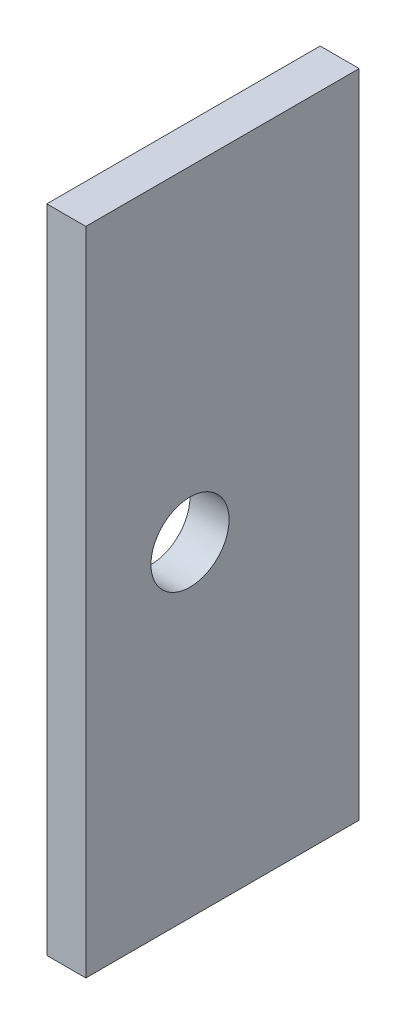
ISO-10303-21;
HEADER;
FILE_DESCRIPTION(('STEP AP214'),'2;1');
FILE_NAME('part.step','',(''),(''),'','','');
FILE_SCHEMA(('AUTOMOTIVE_DESIGN { 1 0 10303 214 1 1 1 1 }'));
ENDSEC;
DATA;
#1=APPLICATION_CONTEXT('core data for automotive mechanical design processes');
#2=APPLICATION_PROTOCOL_DEFINITION('international standard','automotive_design',2000,#1);
#3=PRODUCT_CONTEXT('',#1,'mechanical');
#4=PRODUCT('Part','Part','',(#3));
#5=PRODUCT_RELATED_PRODUCT_CATEGORY('part','',(#4));
#6=PRODUCT_DEFINITION_FORMATION('','',#4);
#7=PRODUCT_DEFINITION_CONTEXT('part definition',#1,'design');
#8=PRODUCT_DEFINITION('design','',#6,#7);
#9=PRODUCT_DEFINITION_SHAPE('','',#8);
#10=(LENGTH_UNIT() NAMED_UNIT(*) SI_UNIT(.MILLI.,.METRE.));
#11=(NAMED_UNIT(*) PLANE_ANGLE_UNIT() SI_UNIT($,.RADIAN.));
#12=(NAMED_UNIT(*) SI_UNIT($,.STERADIAN.) SOLID_ANGLE_UNIT());
#13=UNCERTAINTY_MEASURE_WITH_UNIT(LENGTH_MEASURE(1.E-05),#10,'distance_accuracy_value','');
#14=(GEOMETRIC_REPRESENTATION_CONTEXT(3) GLOBAL_UNCERTAINTY_ASSIGNED_CONTEXT((#13)) GLOBAL_UNIT_ASSIGNED_CONTEXT((#10,
#11,#12)) REPRESENTATION_CONTEXT('',''));
#15=CARTESIAN_POINT('',(0.,0.,0.));
#16=DIRECTION('',(0.,0.,1.));
#17=DIRECTION('',(1.,0.,0.));
#18=AXIS2_PLACEMENT_3D('',#15,#16,#17);
#19=CARTESIAN_POINT('',(0.3,0.,0.));
#20=DIRECTION('',(0.,0.,-1.));
#21=DIRECTION('',(0.,1.,0.));
#22=AXIS2_PLACEMENT_3D('',#19,#20,#21);
#23=PLANE('',#22);
#24=DIRECTION('',(0.,-1.,0.));
#25=VECTOR('',#24,1.);
#26=CARTESIAN_POINT('',(0.,0.,0.));
#27=LINE('',#26,#25);
#28=CARTESIAN_POINT('',(0.,5.,0.));
#29=VERTEX_POINT('',#28);
#30=CARTESIAN_POINT('',(0.,0.,0.));
#31=VERTEX_POINT('',#30);
#32=EDGE_CURVE('E110',#29,#31,#27,.T.);
#33=ORIENTED_EDGE('',*,*,#32,.T.);
#34=DIRECTION('',(-1.,0.,0.));
#35=VECTOR('',#34,1.);
#36=CARTESIAN_POINT('',(0.3,0.,0.));
#37=LINE('',#36,#35);
#38=CARTESIAN_POINT('',(0.3,0.,0.));
#39=VERTEX_POINT('',#38);
#40=EDGE_CURVE('E13',#39,#31,#37,.T.);
#41=ORIENTED_EDGE('',*,*,#40,.F.);
#42=DIRECTION('',(0.,-1.,0.));
#43=VECTOR('',#42,1.);
#44=CARTESIAN_POINT('',(0.3,0.,0.));
#45=LINE('',#44,#43);
#46=CARTESIAN_POINT('',(0.3,5.,0.));
#47=VERTEX_POINT('',#46);
#48=EDGE_CURVE('E98',#47,#39,#45,.T.);
#49=ORIENTED_EDGE('',*,*,#48,.F.);
#50=DIRECTION('',(-1.,0.,0.));
#51=VECTOR('',#50,1.);
#52=CARTESIAN_POINT('',(0.3,5.,0.));
#53=LINE('',#52,#51);
#54=EDGE_CURVE('E106',#47,#29,#53,.T.);
#55=ORIENTED_EDGE('',*,*,#54,.T.);
#56=EDGE_LOOP('',(#33,#41,#49,#55));
#57=FACE_BOUND('',#56,.T.);
#58=ADVANCED_FACE('F47',(#57),#23,.F.);
#59=CARTESIAN_POINT('',(0.3,0.,0.));
#60=DIRECTION('',(0.,1.,0.));
#61=DIRECTION('',(0.,0.,1.));
#62=AXIS2_PLACEMENT_3D('',#59,#60,#61);
#63=PLANE('',#62);
#64=DIRECTION('',(0.,0.,-1.));
#65=VECTOR('',#64,1.);
#66=CARTESIAN_POINT('',(0.,0.,0.));
#67=LINE('',#66,#65);
#68=CARTESIAN_POINT('',(0.,0.,-2.1));
#69=VERTEX_POINT('',#68);
#70=EDGE_CURVE('E102',#31,#69,#67,.T.);
#71=ORIENTED_EDGE('',*,*,#70,.T.);
#72=DIRECTION('',(-1.,0.,0.));
#73=VECTOR('',#72,1.);
#74=CARTESIAN_POINT('',(0.3,0.,-2.1));
#75=LINE('',#74,#73);
#76=CARTESIAN_POINT('',(0.3,0.,-2.1));
#77=VERTEX_POINT('',#76);
#78=EDGE_CURVE('E55',#77,#69,#75,.T.);
#79=ORIENTED_EDGE('',*,*,#78,.F.);
#80=DIRECTION('',(0.,0.,-1.));
#81=VECTOR('',#80,1.);
#82=CARTESIAN_POINT('',(0.3,0.,0.));
#83=LINE('',#82,#81);
#84=EDGE_CURVE('E93',#39,#77,#83,.T.);
#85=ORIENTED_EDGE('',*,*,#84,.F.);
#86=ORIENTED_EDGE('',*,*,#40,.T.);
#87=EDGE_LOOP('',(#71,#79,#85,#86));
#88=FACE_BOUND('',#87,.T.);
#89=ADVANCED_FACE('F101',(#88),#63,.F.);
#90=CARTESIAN_POINT('',(0.3,0.,-2.1));
#91=DIRECTION('',(0.,0.,1.));
#92=DIRECTION('',(0.,-1.,0.));
#93=AXIS2_PLACEMENT_3D('',#90,#91,#92);
#94=PLANE('',#93);
#95=DIRECTION('',(0.,1.,0.));
#96=VECTOR('',#95,1.);
#97=CARTESIAN_POINT('',(0.,0.,-2.1));
#98=LINE('',#97,#96);
#99=CARTESIAN_POINT('',(0.,5.,-2.1));
#100=VERTEX_POINT('',#99);
#101=EDGE_CURVE('E80',#69,#100,#98,.T.);
#102=ORIENTED_EDGE('',*,*,#101,.T.);
#103=DIRECTION('',(-1.,0.,0.));
#104=VECTOR('',#103,1.);
#105=CARTESIAN_POINT('',(0.3,5.,-2.1));
#106=LINE('',#105,#104);
#107=CARTESIAN_POINT('',(0.3,5.,-2.1));
#108=VERTEX_POINT('',#107);
#109=EDGE_CURVE('E103',#108,#100,#106,.T.);
#110=ORIENTED_EDGE('',*,*,#109,.F.);
#111=DIRECTION('',(0.,1.,0.));
#112=VECTOR('',#111,1.);
#113=CARTESIAN_POINT('',(0.3,0.,-2.1));
#114=LINE('',#113,#112);
#115=EDGE_CURVE('E96',#77,#108,#114,.T.);
#116=ORIENTED_EDGE('',*,*,#115,.F.);
#117=ORIENTED_EDGE('',*,*,#78,.T.);
#118=EDGE_LOOP('',(#102,#110,#116,#117));
#119=FACE_BOUND('',#118,.T.);
#120=ADVANCED_FACE('F104',(#119),#94,.F.);
#121=CARTESIAN_POINT('',(0.3,5.,0.));
#122=DIRECTION('',(0.,-1.,0.));
#123=DIRECTION('',(0.,0.,-1.));
#124=AXIS2_PLACEMENT_3D('',#121,#122,#123);
#125=PLANE('',#124);
#126=DIRECTION('',(0.,0.,1.));
#127=VECTOR('',#126,1.);
#128=CARTESIAN_POINT('',(0.,5.,0.));
#129=LINE('',#128,#127);
#130=EDGE_CURVE('E86',#100,#29,#129,.T.);
#131=ORIENTED_EDGE('',*,*,#130,.T.);
#132=ORIENTED_EDGE('',*,*,#54,.F.);
#133=DIRECTION('',(0.,0.,1.));
#134=VECTOR('',#133,1.);
#135=CARTESIAN_POINT('',(0.3,5.,0.));
#136=LINE('',#135,#134);
#137=EDGE_CURVE('E63',#108,#47,#136,.T.);
#138=ORIENTED_EDGE('',*,*,#137,.F.);
#139=ORIENTED_EDGE('',*,*,#109,.T.);
#140=EDGE_LOOP('',(#131,#132,#138,#139));
#141=FACE_BOUND('',#140,.T.);
#142=ADVANCED_FACE('F118',(#141),#125,.F.);
#143=CARTESIAN_POINT('',(0.3,0.,0.));
#144=DIRECTION('',(-1.,0.,0.));
#145=DIRECTION('',(0.,0.,1.));
#146=AXIS2_PLACEMENT_3D('',#143,#144,#145);
#147=PLANE('',#146);
#148=CARTESIAN_POINT('',(0.3,2.5,-0.800000000000002));
#149=DIRECTION('',(1.,0.,0.));
#150=DIRECTION('',(0.,0.,-1.));
#151=AXIS2_PLACEMENT_3D('',#148,#149,#150);
#152=CIRCLE('',#151,0.299999999999999);
#153=CARTESIAN_POINT('',(0.3,2.5,-1.1));
#154=VERTEX_POINT('',#153);
#155=EDGE_CURVE('E126',#154,#154,#152,.T.);
#156=ORIENTED_EDGE('',*,*,#155,.F.);
#157=EDGE_LOOP('',(#156));
#158=FACE_BOUND('',#157,.T.);
#159=ORIENTED_EDGE('',*,*,#48,.T.);
#160=ORIENTED_EDGE('',*,*,#84,.T.);
#161=ORIENTED_EDGE('',*,*,#115,.T.);
#162=ORIENTED_EDGE('',*,*,#137,.T.);
#163=EDGE_LOOP('',(#159,#160,#161,#162));
#164=FACE_BOUND('',#163,.T.);
#165=ADVANCED_FACE('F94',(#158,#164),#147,.F.);
#166=CARTESIAN_POINT('',(0.,0.,0.));
#167=DIRECTION('',(-1.,0.,0.));
#168=DIRECTION('',(0.,0.,1.));
#169=AXIS2_PLACEMENT_3D('',#166,#167,#168);
#170=PLANE('',#169);
#171=CARTESIAN_POINT('',(0.,2.5,-0.799999999999999));
#172=DIRECTION('',(1.,0.,0.));
#173=DIRECTION('',(0.,0.,-1.));
#174=AXIS2_PLACEMENT_3D('',#171,#172,#173);
#175=CIRCLE('',#174,0.299999999999999);
#176=CARTESIAN_POINT('',(0.,2.5,-1.1));
#177=VERTEX_POINT('',#176);
#178=EDGE_CURVE('E113',#177,#177,#175,.T.);
#179=ORIENTED_EDGE('',*,*,#178,.T.);
#180=EDGE_LOOP('',(#179));
#181=FACE_BOUND('',#180,.T.);
#182=ORIENTED_EDGE('',*,*,#32,.F.);
#183=ORIENTED_EDGE('',*,*,#130,.F.);
#184=ORIENTED_EDGE('',*,*,#101,.F.);
#185=ORIENTED_EDGE('',*,*,#70,.F.);
#186=EDGE_LOOP('',(#182,#183,#184,#185));
#187=FACE_BOUND('',#186,.T.);
#188=ADVANCED_FACE('F121',(#181,#187),#170,.T.);
#189=CARTESIAN_POINT('',(0.3,2.5,-0.800000000000002));
#190=DIRECTION('',(1.,0.,0.));
#191=DIRECTION('',(0.,0.,-1.));
#192=AXIS2_PLACEMENT_3D('',#189,#190,#191);
#193=CYLINDRICAL_SURFACE('',#192,0.299999999999999);
#194=ORIENTED_EDGE('',*,*,#178,.F.);
#195=EDGE_LOOP('',(#194));
#196=FACE_BOUND('',#195,.T.);
#197=ORIENTED_EDGE('',*,*,#155,.T.);
#198=EDGE_LOOP('',(#197));
#199=FACE_BOUND('',#198,.T.);
#200=ADVANCED_FACE('F130',(#196,#199),#193,.F.);
#201=CLOSED_SHELL('',(#58,#89,#120,#142,#165,#188,#200));
#202=MANIFOLD_SOLID_BREP('B2',#201);
#203=ADVANCED_BREP_SHAPE_REPRESENTATION('',(#18,#202),#14);
#204=SHAPE_DEFINITION_REPRESENTATION(#9,#203);
ENDSEC;
END-ISO-10303-21;
